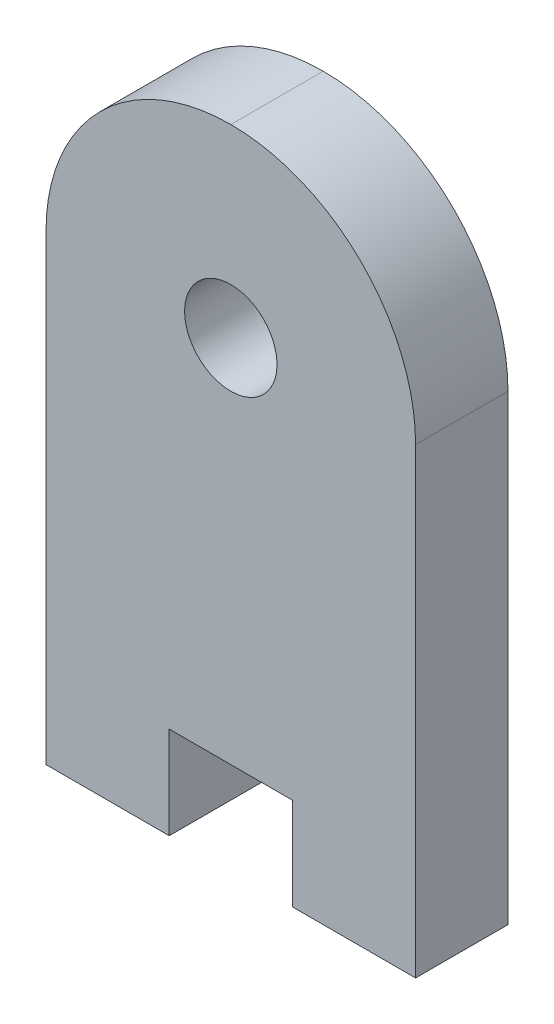
ISO-10303-21;
HEADER;
FILE_DESCRIPTION(('STEP AP214'),'2;1');
FILE_NAME('part.step','',(''),(''),'','','');
FILE_SCHEMA(('AUTOMOTIVE_DESIGN { 1 0 10303 214 1 1 1 1 }'));
ENDSEC;
DATA;
#1=APPLICATION_CONTEXT('core data for automotive mechanical design processes');
#2=APPLICATION_PROTOCOL_DEFINITION('international standard','automotive_design',2000,#1);
#3=PRODUCT_CONTEXT('',#1,'mechanical');
#4=PRODUCT('Part','Part','',(#3));
#5=PRODUCT_RELATED_PRODUCT_CATEGORY('part','',(#4));
#6=PRODUCT_DEFINITION_FORMATION('','',#4);
#7=PRODUCT_DEFINITION_CONTEXT('part definition',#1,'design');
#8=PRODUCT_DEFINITION('design','',#6,#7);
#9=PRODUCT_DEFINITION_SHAPE('','',#8);
#10=(LENGTH_UNIT() NAMED_UNIT(*) SI_UNIT(.MILLI.,.METRE.));
#11=(NAMED_UNIT(*) PLANE_ANGLE_UNIT() SI_UNIT($,.RADIAN.));
#12=(NAMED_UNIT(*) SI_UNIT($,.STERADIAN.) SOLID_ANGLE_UNIT());
#13=UNCERTAINTY_MEASURE_WITH_UNIT(LENGTH_MEASURE(1.E-05),#10,'distance_accuracy_value','');
#14=(GEOMETRIC_REPRESENTATION_CONTEXT(3) GLOBAL_UNCERTAINTY_ASSIGNED_CONTEXT((#13)) GLOBAL_UNIT_ASSIGNED_CONTEXT((#10,
#11,#12)) REPRESENTATION_CONTEXT('',''));
#15=CARTESIAN_POINT('',(0.,0.,0.));
#16=DIRECTION('',(0.,0.,1.));
#17=DIRECTION('',(1.,0.,0.));
#18=AXIS2_PLACEMENT_3D('',#15,#16,#17);
#19=CARTESIAN_POINT('',(10.,-15.,5.));
#20=DIRECTION('',(0.,1.,0.));
#21=DIRECTION('',(-1.,0.,0.));
#22=AXIS2_PLACEMENT_3D('',#19,#20,#21);
#23=PLANE('',#22);
#24=DIRECTION('',(0.,0.,-1.));
#25=VECTOR('',#24,1.);
#26=CARTESIAN_POINT('',(3.33333333333334,-15.,5.));
#27=LINE('',#26,#25);
#28=CARTESIAN_POINT('',(3.33333333333333,-15.,5.));
#29=VERTEX_POINT('',#28);
#30=CARTESIAN_POINT('',(3.33333333333333,-15.,0.));
#31=VERTEX_POINT('',#30);
#32=EDGE_CURVE('E50',#29,#31,#27,.T.);
#33=ORIENTED_EDGE('',*,*,#32,.F.);
#34=DIRECTION('',(1.,0.,0.));
#35=VECTOR('',#34,1.);
#36=CARTESIAN_POINT('',(10.,-15.,5.));
#37=LINE('',#36,#35);
#38=CARTESIAN_POINT('',(-3.33333333333333,-15.,5.));
#39=VERTEX_POINT('',#38);
#40=EDGE_CURVE('E113',#39,#29,#37,.T.);
#41=ORIENTED_EDGE('',*,*,#40,.F.);
#42=DIRECTION('',(0.,0.,1.));
#43=VECTOR('',#42,1.);
#44=CARTESIAN_POINT('',(-3.33333333333333,-15.,5.));
#45=LINE('',#44,#43);
#46=CARTESIAN_POINT('',(-3.33333333333333,-15.,0.));
#47=VERTEX_POINT('',#46);
#48=EDGE_CURVE('E137',#47,#39,#45,.T.);
#49=ORIENTED_EDGE('',*,*,#48,.F.);
#50=DIRECTION('',(1.,0.,0.));
#51=VECTOR('',#50,1.);
#52=CARTESIAN_POINT('',(10.,-15.,0.));
#53=LINE('',#52,#51);
#54=EDGE_CURVE('E55',#47,#31,#53,.T.);
#55=ORIENTED_EDGE('',*,*,#54,.T.);
#56=EDGE_LOOP('',(#33,#41,#49,#55));
#57=FACE_BOUND('',#56,.T.);
#58=ADVANCED_FACE('F33',(#57),#23,.F.);
#59=CARTESIAN_POINT('',(-10.,-15.,5.));
#60=DIRECTION('',(1.,0.,0.));
#61=DIRECTION('',(0.,0.,-1.));
#62=AXIS2_PLACEMENT_3D('',#59,#60,#61);
#63=PLANE('',#62);
#64=DIRECTION('',(0.,-1.,0.));
#65=VECTOR('',#64,1.);
#66=CARTESIAN_POINT('',(-10.,-15.,5.));
#67=LINE('',#66,#65);
#68=CARTESIAN_POINT('',(-10.,4.99999999999999,5.));
#69=VERTEX_POINT('',#68);
#70=CARTESIAN_POINT('',(-10.,-20.,5.));
#71=VERTEX_POINT('',#70);
#72=EDGE_CURVE('E174',#69,#71,#67,.T.);
#73=ORIENTED_EDGE('',*,*,#72,.F.);
#74=DIRECTION('',(0.,0.,-1.));
#75=VECTOR('',#74,1.);
#76=CARTESIAN_POINT('',(-10.,4.99999999999999,5.));
#77=LINE('',#76,#75);
#78=CARTESIAN_POINT('',(-10.,4.99999999999999,0.));
#79=VERTEX_POINT('',#78);
#80=EDGE_CURVE('E112',#69,#79,#77,.T.);
#81=ORIENTED_EDGE('',*,*,#80,.T.);
#82=DIRECTION('',(0.,-1.,0.));
#83=VECTOR('',#82,1.);
#84=CARTESIAN_POINT('',(-10.,-15.,0.));
#85=LINE('',#84,#83);
#86=CARTESIAN_POINT('',(-10.,-20.,0.));
#87=VERTEX_POINT('',#86);
#88=EDGE_CURVE('E178',#79,#87,#85,.T.);
#89=ORIENTED_EDGE('',*,*,#88,.T.);
#90=DIRECTION('',(0.,0.,-1.));
#91=VECTOR('',#90,1.);
#92=CARTESIAN_POINT('',(-10.,-20.,5.));
#93=LINE('',#92,#91);
#94=EDGE_CURVE('E138',#71,#87,#93,.T.);
#95=ORIENTED_EDGE('',*,*,#94,.F.);
#96=EDGE_LOOP('',(#73,#81,#89,#95));
#97=FACE_BOUND('',#96,.T.);
#98=ADVANCED_FACE('F197',(#97),#63,.F.);
#99=CARTESIAN_POINT('',(10.,-15.,5.));
#100=DIRECTION('',(-1.,0.,0.));
#101=DIRECTION('',(0.,0.,1.));
#102=AXIS2_PLACEMENT_3D('',#99,#100,#101);
#103=PLANE('',#102);
#104=DIRECTION('',(0.,1.,0.));
#105=VECTOR('',#104,1.);
#106=CARTESIAN_POINT('',(10.,-15.,0.));
#107=LINE('',#106,#105);
#108=CARTESIAN_POINT('',(10.,-20.,0.));
#109=VERTEX_POINT('',#108);
#110=CARTESIAN_POINT('',(10.,4.99999999999999,0.));
#111=VERTEX_POINT('',#110);
#112=EDGE_CURVE('E175',#109,#111,#107,.T.);
#113=ORIENTED_EDGE('',*,*,#112,.T.);
#114=DIRECTION('',(0.,0.,-1.));
#115=VECTOR('',#114,1.);
#116=CARTESIAN_POINT('',(10.,4.99999999999999,5.));
#117=LINE('',#116,#115);
#118=CARTESIAN_POINT('',(10.,4.99999999999999,5.));
#119=VERTEX_POINT('',#118);
#120=EDGE_CURVE('E11',#111,#119,#117,.F.);
#121=ORIENTED_EDGE('',*,*,#120,.T.);
#122=DIRECTION('',(0.,1.,0.));
#123=VECTOR('',#122,1.);
#124=CARTESIAN_POINT('',(10.,-15.,5.));
#125=LINE('',#124,#123);
#126=CARTESIAN_POINT('',(10.,-20.,5.));
#127=VERTEX_POINT('',#126);
#128=EDGE_CURVE('E103',#127,#119,#125,.T.);
#129=ORIENTED_EDGE('',*,*,#128,.F.);
#130=DIRECTION('',(0.,0.,1.));
#131=VECTOR('',#130,1.);
#132=CARTESIAN_POINT('',(10.,-20.,5.));
#133=LINE('',#132,#131);
#134=EDGE_CURVE('E108',#109,#127,#133,.T.);
#135=ORIENTED_EDGE('',*,*,#134,.F.);
#136=EDGE_LOOP('',(#113,#121,#129,#135));
#137=FACE_BOUND('',#136,.T.);
#138=ADVANCED_FACE('F106',(#137),#103,.F.);
#139=CARTESIAN_POINT('',(0.,0.,5.));
#140=DIRECTION('',(0.,0.,1.));
#141=DIRECTION('',(1.,0.,0.));
#142=AXIS2_PLACEMENT_3D('',#139,#140,#141);
#143=PLANE('',#142);
#144=CARTESIAN_POINT('',(0.,4.99999999999999,5.));
#145=DIRECTION('',(0.,0.,-1.));
#146=DIRECTION('',(-1.,0.,0.));
#147=AXIS2_PLACEMENT_3D('',#144,#145,#146);
#148=CIRCLE('',#147,2.5);
#149=CARTESIAN_POINT('',(-2.5,4.99999999999999,5.));
#150=VERTEX_POINT('',#149);
#151=EDGE_CURVE('E151',#150,#150,#148,.T.);
#152=ORIENTED_EDGE('',*,*,#151,.T.);
#153=EDGE_LOOP('',(#152));
#154=FACE_BOUND('',#153,.T.);
#155=CARTESIAN_POINT('',(0.,4.99999999999999,5.));
#156=DIRECTION('',(0.,0.,1.));
#157=DIRECTION('',(1.,0.,0.));
#158=AXIS2_PLACEMENT_3D('',#155,#156,#157);
#159=CIRCLE('',#158,10.);
#160=CARTESIAN_POINT('',(0.,15.,5.));
#161=VERTEX_POINT('',#160);
#162=EDGE_CURVE('E187',#119,#161,#159,.T.);
#163=ORIENTED_EDGE('',*,*,#162,.T.);
#164=CARTESIAN_POINT('',(0.,4.99999999999999,5.));
#165=DIRECTION('',(0.,0.,1.));
#166=DIRECTION('',(1.,0.,0.));
#167=AXIS2_PLACEMENT_3D('',#164,#165,#166);
#168=CIRCLE('',#167,10.);
#169=EDGE_CURVE('E42',#161,#69,#168,.T.);
#170=ORIENTED_EDGE('',*,*,#169,.T.);
#171=ORIENTED_EDGE('',*,*,#72,.T.);
#172=DIRECTION('',(-1.,0.,0.));
#173=VECTOR('',#172,1.);
#174=CARTESIAN_POINT('',(-10.,-20.,5.));
#175=LINE('',#174,#173);
#176=CARTESIAN_POINT('',(-3.33333333333333,-20.,5.));
#177=VERTEX_POINT('',#176);
#178=EDGE_CURVE('E145',#177,#71,#175,.T.);
#179=ORIENTED_EDGE('',*,*,#178,.F.);
#180=DIRECTION('',(0.,1.,0.));
#181=VECTOR('',#180,1.);
#182=CARTESIAN_POINT('',(-3.33333333333333,-20.,5.));
#183=LINE('',#182,#181);
#184=EDGE_CURVE('E148',#177,#39,#183,.T.);
#185=ORIENTED_EDGE('',*,*,#184,.T.);
#186=ORIENTED_EDGE('',*,*,#40,.T.);
#187=DIRECTION('',(0.,1.,0.));
#188=VECTOR('',#187,1.);
#189=CARTESIAN_POINT('',(3.33333333333334,-20.,5.));
#190=LINE('',#189,#188);
#191=CARTESIAN_POINT('',(3.33333333333334,-20.,5.));
#192=VERTEX_POINT('',#191);
#193=EDGE_CURVE('E119',#192,#29,#190,.T.);
#194=ORIENTED_EDGE('',*,*,#193,.F.);
#195=DIRECTION('',(-1.,0.,0.));
#196=VECTOR('',#195,1.);
#197=CARTESIAN_POINT('',(10.,-20.,5.));
#198=LINE('',#197,#196);
#199=EDGE_CURVE('E116',#127,#192,#198,.T.);
#200=ORIENTED_EDGE('',*,*,#199,.F.);
#201=ORIENTED_EDGE('',*,*,#128,.T.);
#202=EDGE_LOOP('',(#163,#170,#171,#179,#185,#186,#194,#200,#201));
#203=FACE_BOUND('',#202,.T.);
#204=ADVANCED_FACE('F117',(#154,#203),#143,.T.);
#205=CARTESIAN_POINT('',(0.,0.,0.));
#206=DIRECTION('',(0.,0.,1.));
#207=DIRECTION('',(1.,0.,0.));
#208=AXIS2_PLACEMENT_3D('',#205,#206,#207);
#209=PLANE('',#208);
#210=CARTESIAN_POINT('',(0.,4.99999999999999,0.));
#211=DIRECTION('',(0.,0.,-1.));
#212=DIRECTION('',(-1.,0.,0.));
#213=AXIS2_PLACEMENT_3D('',#210,#211,#212);
#214=CIRCLE('',#213,2.5);
#215=CARTESIAN_POINT('',(-2.5,4.99999999999999,0.));
#216=VERTEX_POINT('',#215);
#217=EDGE_CURVE('E164',#216,#216,#214,.T.);
#218=ORIENTED_EDGE('',*,*,#217,.F.);
#219=EDGE_LOOP('',(#218));
#220=FACE_BOUND('',#219,.T.);
#221=ORIENTED_EDGE('',*,*,#88,.F.);
#222=CARTESIAN_POINT('',(0.,4.99999999999999,0.));
#223=DIRECTION('',(0.,0.,1.));
#224=DIRECTION('',(1.,0.,0.));
#225=AXIS2_PLACEMENT_3D('',#222,#223,#224);
#226=CIRCLE('',#225,10.);
#227=CARTESIAN_POINT('',(0.,15.,0.));
#228=VERTEX_POINT('',#227);
#229=EDGE_CURVE('E189',#79,#228,#226,.F.);
#230=ORIENTED_EDGE('',*,*,#229,.T.);
#231=CARTESIAN_POINT('',(0.,4.99999999999999,0.));
#232=DIRECTION('',(0.,0.,1.));
#233=DIRECTION('',(1.,0.,0.));
#234=AXIS2_PLACEMENT_3D('',#231,#232,#233);
#235=CIRCLE('',#234,10.);
#236=EDGE_CURVE('E191',#228,#111,#235,.F.);
#237=ORIENTED_EDGE('',*,*,#236,.T.);
#238=ORIENTED_EDGE('',*,*,#112,.F.);
#239=DIRECTION('',(1.,0.,0.));
#240=VECTOR('',#239,1.);
#241=CARTESIAN_POINT('',(10.,-20.,0.));
#242=LINE('',#241,#240);
#243=CARTESIAN_POINT('',(3.33333333333333,-20.,0.));
#244=VERTEX_POINT('',#243);
#245=EDGE_CURVE('E127',#244,#109,#242,.T.);
#246=ORIENTED_EDGE('',*,*,#245,.F.);
#247=DIRECTION('',(0.,1.,0.));
#248=VECTOR('',#247,1.);
#249=CARTESIAN_POINT('',(3.33333333333333,-20.,0.));
#250=LINE('',#249,#248);
#251=EDGE_CURVE('E132',#244,#31,#250,.T.);
#252=ORIENTED_EDGE('',*,*,#251,.T.);
#253=ORIENTED_EDGE('',*,*,#54,.F.);
#254=DIRECTION('',(0.,1.,0.));
#255=VECTOR('',#254,1.);
#256=CARTESIAN_POINT('',(-3.33333333333333,-20.,0.));
#257=LINE('',#256,#255);
#258=CARTESIAN_POINT('',(-3.33333333333333,-20.,0.));
#259=VERTEX_POINT('',#258);
#260=EDGE_CURVE('E161',#259,#47,#257,.T.);
#261=ORIENTED_EDGE('',*,*,#260,.F.);
#262=DIRECTION('',(1.,0.,0.));
#263=VECTOR('',#262,1.);
#264=CARTESIAN_POINT('',(-10.,-20.,0.));
#265=LINE('',#264,#263);
#266=EDGE_CURVE('E141',#87,#259,#265,.T.);
#267=ORIENTED_EDGE('',*,*,#266,.F.);
#268=EDGE_LOOP('',(#221,#230,#237,#238,#246,#252,#253,#261,#267));
#269=FACE_BOUND('',#268,.T.);
#270=ADVANCED_FACE('F203',(#220,#269),#209,.F.);
#271=CARTESIAN_POINT('',(0.,4.99999999999999,5.));
#272=DIRECTION('',(0.,0.,-1.));
#273=DIRECTION('',(-1.,0.,0.));
#274=AXIS2_PLACEMENT_3D('',#271,#272,#273);
#275=CYLINDRICAL_SURFACE('',#274,10.);
#276=DIRECTION('',(0.,0.,-1.));
#277=VECTOR('',#276,1.);
#278=CARTESIAN_POINT('',(0.,15.,5.));
#279=LINE('',#278,#277);
#280=EDGE_CURVE('E172',#161,#228,#279,.T.);
#281=ORIENTED_EDGE('',*,*,#280,.F.);
#282=ORIENTED_EDGE('',*,*,#162,.F.);
#283=ORIENTED_EDGE('',*,*,#120,.F.);
#284=ORIENTED_EDGE('',*,*,#236,.F.);
#285=EDGE_LOOP('',(#281,#282,#283,#284));
#286=FACE_BOUND('',#285,.T.);
#287=ADVANCED_FACE('F35',(#286),#275,.T.);
#288=CARTESIAN_POINT('',(0.,4.99999999999999,5.));
#289=DIRECTION('',(0.,0.,-1.));
#290=DIRECTION('',(-1.,0.,0.));
#291=AXIS2_PLACEMENT_3D('',#288,#289,#290);
#292=CYLINDRICAL_SURFACE('',#291,10.);
#293=ORIENTED_EDGE('',*,*,#169,.F.);
#294=ORIENTED_EDGE('',*,*,#280,.T.);
#295=ORIENTED_EDGE('',*,*,#229,.F.);
#296=ORIENTED_EDGE('',*,*,#80,.F.);
#297=EDGE_LOOP('',(#293,#294,#295,#296));
#298=FACE_BOUND('',#297,.T.);
#299=ADVANCED_FACE('F210',(#298),#292,.T.);
#300=CARTESIAN_POINT('',(0.,4.99999999999999,5.));
#301=DIRECTION('',(0.,0.,-1.));
#302=DIRECTION('',(-1.,0.,0.));
#303=AXIS2_PLACEMENT_3D('',#300,#301,#302);
#304=CYLINDRICAL_SURFACE('',#303,2.5);
#305=ORIENTED_EDGE('',*,*,#151,.F.);
#306=EDGE_LOOP('',(#305));
#307=FACE_BOUND('',#306,.T.);
#308=ORIENTED_EDGE('',*,*,#217,.T.);
#309=EDGE_LOOP('',(#308));
#310=FACE_BOUND('',#309,.T.);
#311=ADVANCED_FACE('F233',(#307,#310),#304,.F.);
#312=CARTESIAN_POINT('',(-3.33333333333333,-20.,5.));
#313=DIRECTION('',(-1.,0.,0.));
#314=DIRECTION('',(0.,0.,1.));
#315=AXIS2_PLACEMENT_3D('',#312,#313,#314);
#316=PLANE('',#315);
#317=ORIENTED_EDGE('',*,*,#48,.T.);
#318=ORIENTED_EDGE('',*,*,#184,.F.);
#319=DIRECTION('',(0.,0.,1.));
#320=VECTOR('',#319,1.);
#321=CARTESIAN_POINT('',(-3.33333333333333,-20.,5.));
#322=LINE('',#321,#320);
#323=EDGE_CURVE('E143',#259,#177,#322,.T.);
#324=ORIENTED_EDGE('',*,*,#323,.F.);
#325=ORIENTED_EDGE('',*,*,#260,.T.);
#326=EDGE_LOOP('',(#317,#318,#324,#325));
#327=FACE_BOUND('',#326,.T.);
#328=ADVANCED_FACE('F222',(#327),#316,.F.);
#329=CARTESIAN_POINT('',(0.,-20.,0.));
#330=DIRECTION('',(0.,-1.,0.));
#331=DIRECTION('',(0.,0.,-1.));
#332=AXIS2_PLACEMENT_3D('',#329,#330,#331);
#333=PLANE('',#332);
#334=ORIENTED_EDGE('',*,*,#94,.T.);
#335=ORIENTED_EDGE('',*,*,#266,.T.);
#336=ORIENTED_EDGE('',*,*,#323,.T.);
#337=ORIENTED_EDGE('',*,*,#178,.T.);
#338=EDGE_LOOP('',(#334,#335,#336,#337));
#339=FACE_BOUND('',#338,.T.);
#340=ADVANCED_FACE('F206',(#339),#333,.T.);
#341=CARTESIAN_POINT('',(3.33333333333334,-20.,5.));
#342=DIRECTION('',(1.,0.,0.));
#343=DIRECTION('',(0.,0.,-1.));
#344=AXIS2_PLACEMENT_3D('',#341,#342,#343);
#345=PLANE('',#344);
#346=ORIENTED_EDGE('',*,*,#32,.T.);
#347=ORIENTED_EDGE('',*,*,#251,.F.);
#348=DIRECTION('',(0.,0.,-1.));
#349=VECTOR('',#348,1.);
#350=CARTESIAN_POINT('',(3.33333333333334,-20.,5.));
#351=LINE('',#350,#349);
#352=EDGE_CURVE('E122',#192,#244,#351,.T.);
#353=ORIENTED_EDGE('',*,*,#352,.F.);
#354=ORIENTED_EDGE('',*,*,#193,.T.);
#355=EDGE_LOOP('',(#346,#347,#353,#354));
#356=FACE_BOUND('',#355,.T.);
#357=ADVANCED_FACE('F214',(#356),#345,.F.);
#358=CARTESIAN_POINT('',(0.,-20.,0.));
#359=DIRECTION('',(0.,1.,0.));
#360=DIRECTION('',(0.,0.,1.));
#361=AXIS2_PLACEMENT_3D('',#358,#359,#360);
#362=PLANE('',#361);
#363=ORIENTED_EDGE('',*,*,#134,.T.);
#364=ORIENTED_EDGE('',*,*,#199,.T.);
#365=ORIENTED_EDGE('',*,*,#352,.T.);
#366=ORIENTED_EDGE('',*,*,#245,.T.);
#367=EDGE_LOOP('',(#363,#364,#365,#366));
#368=FACE_BOUND('',#367,.T.);
#369=ADVANCED_FACE('F125',(#368),#362,.F.);
#370=CLOSED_SHELL('',(#58,#98,#138,#204,#270,#287,#299,#311,#328,#340,#357,#369));
#371=MANIFOLD_SOLID_BREP('B2',#370);
#372=ADVANCED_BREP_SHAPE_REPRESENTATION('',(#18,#371),#14);
#373=SHAPE_DEFINITION_REPRESENTATION(#9,#372);
ENDSEC;
END-ISO-10303-21;
